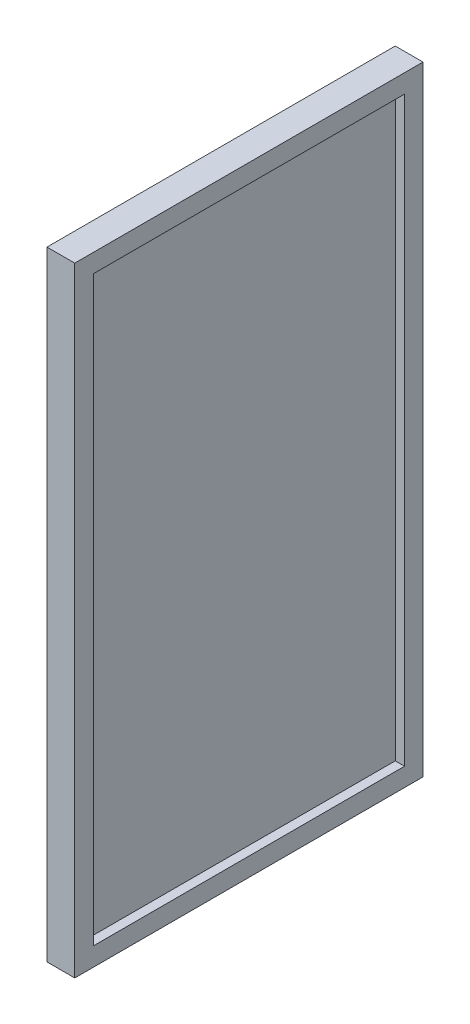
ISO-10303-21;
HEADER;
FILE_DESCRIPTION(('STEP AP214'),'2;1');
FILE_NAME('part.step','',(''),(''),'','','');
FILE_SCHEMA(('AUTOMOTIVE_DESIGN { 1 0 10303 214 1 1 1 1 }'));
ENDSEC;
DATA;
#1=APPLICATION_CONTEXT('core data for automotive mechanical design processes');
#2=APPLICATION_PROTOCOL_DEFINITION('international standard','automotive_design',2000,#1);
#3=PRODUCT_CONTEXT('',#1,'mechanical');
#4=PRODUCT('Part','Part','',(#3));
#5=PRODUCT_RELATED_PRODUCT_CATEGORY('part','',(#4));
#6=PRODUCT_DEFINITION_FORMATION('','',#4);
#7=PRODUCT_DEFINITION_CONTEXT('part definition',#1,'design');
#8=PRODUCT_DEFINITION('design','',#6,#7);
#9=PRODUCT_DEFINITION_SHAPE('','',#8);
#10=(LENGTH_UNIT() NAMED_UNIT(*) SI_UNIT(.MILLI.,.METRE.));
#11=(NAMED_UNIT(*) PLANE_ANGLE_UNIT() SI_UNIT($,.RADIAN.));
#12=(NAMED_UNIT(*) SI_UNIT($,.STERADIAN.) SOLID_ANGLE_UNIT());
#13=UNCERTAINTY_MEASURE_WITH_UNIT(LENGTH_MEASURE(1.E-05),#10,'distance_accuracy_value','');
#14=(GEOMETRIC_REPRESENTATION_CONTEXT(3) GLOBAL_UNCERTAINTY_ASSIGNED_CONTEXT((#13)) GLOBAL_UNIT_ASSIGNED_CONTEXT((#10,
#11,#12)) REPRESENTATION_CONTEXT('',''));
#15=CARTESIAN_POINT('',(0.,0.,0.));
#16=DIRECTION('',(0.,0.,1.));
#17=DIRECTION('',(1.,0.,0.));
#18=AXIS2_PLACEMENT_3D('',#15,#16,#17);
#19=CARTESIAN_POINT('',(59.,-41.,122.906049713048));
#20=DIRECTION('',(0.,0.,-1.));
#21=DIRECTION('',(-1.,0.,0.));
#22=AXIS2_PLACEMENT_3D('',#19,#20,#21);
#23=PLANE('',#22);
#24=DIRECTION('',(0.,-1.,0.));
#25=VECTOR('',#24,1.);
#26=CARTESIAN_POINT('',(56.,-41.,122.906049713048));
#27=LINE('',#26,#25);
#28=CARTESIAN_POINT('',(56.,25.8959813156576,122.906049713048));
#29=VERTEX_POINT('',#28);
#30=CARTESIAN_POINT('',(56.,-41.,122.906049713048));
#31=VERTEX_POINT('',#30);
#32=EDGE_CURVE('E152',#29,#31,#27,.T.);
#33=ORIENTED_EDGE('',*,*,#32,.T.);
#34=DIRECTION('',(-1.,0.,0.));
#35=VECTOR('',#34,1.);
#36=CARTESIAN_POINT('',(59.,-41.,122.906049713048));
#37=LINE('',#36,#35);
#38=CARTESIAN_POINT('',(59.,-41.,122.906049713048));
#39=VERTEX_POINT('',#38);
#40=EDGE_CURVE('E11',#39,#31,#37,.T.);
#41=ORIENTED_EDGE('',*,*,#40,.F.);
#42=DIRECTION('',(0.,-1.,0.));
#43=VECTOR('',#42,1.);
#44=CARTESIAN_POINT('',(59.,-41.,122.906049713048));
#45=LINE('',#44,#43);
#46=CARTESIAN_POINT('',(59.,25.8959813156576,122.906049713048));
#47=VERTEX_POINT('',#46);
#48=EDGE_CURVE('E156',#47,#39,#45,.T.);
#49=ORIENTED_EDGE('',*,*,#48,.F.);
#50=DIRECTION('',(-1.,0.,0.));
#51=VECTOR('',#50,1.);
#52=CARTESIAN_POINT('',(59.,25.8959813156576,122.906049713048));
#53=LINE('',#52,#51);
#54=EDGE_CURVE('E162',#47,#29,#53,.T.);
#55=ORIENTED_EDGE('',*,*,#54,.T.);
#56=EDGE_LOOP('',(#33,#41,#49,#55));
#57=FACE_BOUND('',#56,.T.);
#58=ADVANCED_FACE('F44',(#57),#23,.F.);
#59=CARTESIAN_POINT('',(59.,-41.,122.906049713048));
#60=DIRECTION('',(0.,1.,0.));
#61=DIRECTION('',(-1.,0.,0.));
#62=AXIS2_PLACEMENT_3D('',#59,#60,#61);
#63=PLANE('',#62);
#64=DIRECTION('',(0.,0.,-1.));
#65=VECTOR('',#64,1.);
#66=CARTESIAN_POINT('',(56.,-41.,122.906049713048));
#67=LINE('',#66,#65);
#68=CARTESIAN_POINT('',(56.,-41.,85.2747997130479));
#69=VERTEX_POINT('',#68);
#70=EDGE_CURVE('E165',#31,#69,#67,.T.);
#71=ORIENTED_EDGE('',*,*,#70,.T.);
#72=DIRECTION('',(-1.,0.,0.));
#73=VECTOR('',#72,1.);
#74=CARTESIAN_POINT('',(59.,-41.,85.2747997130479));
#75=LINE('',#74,#73);
#76=CARTESIAN_POINT('',(59.,-41.,85.2747997130479));
#77=VERTEX_POINT('',#76);
#78=EDGE_CURVE('E51',#77,#69,#75,.T.);
#79=ORIENTED_EDGE('',*,*,#78,.F.);
#80=DIRECTION('',(0.,0.,-1.));
#81=VECTOR('',#80,1.);
#82=CARTESIAN_POINT('',(59.,-41.,122.906049713048));
#83=LINE('',#82,#81);
#84=EDGE_CURVE('E95',#39,#77,#83,.T.);
#85=ORIENTED_EDGE('',*,*,#84,.F.);
#86=ORIENTED_EDGE('',*,*,#40,.T.);
#87=EDGE_LOOP('',(#71,#79,#85,#86));
#88=FACE_BOUND('',#87,.T.);
#89=ADVANCED_FACE('F194',(#88),#63,.F.);
#90=CARTESIAN_POINT('',(59.,-41.,85.2747997130479));
#91=DIRECTION('',(0.,0.,1.));
#92=DIRECTION('',(1.,0.,0.));
#93=AXIS2_PLACEMENT_3D('',#90,#91,#92);
#94=PLANE('',#93);
#95=DIRECTION('',(0.,1.,0.));
#96=VECTOR('',#95,1.);
#97=CARTESIAN_POINT('',(56.,-41.,85.2747997130479));
#98=LINE('',#97,#96);
#99=CARTESIAN_POINT('',(56.,25.8959813156576,85.2747997130479));
#100=VERTEX_POINT('',#99);
#101=EDGE_CURVE('E167',#69,#100,#98,.T.);
#102=ORIENTED_EDGE('',*,*,#101,.T.);
#103=DIRECTION('',(-1.,0.,0.));
#104=VECTOR('',#103,1.);
#105=CARTESIAN_POINT('',(59.,25.8959813156576,85.2747997130479));
#106=LINE('',#105,#104);
#107=CARTESIAN_POINT('',(59.,25.8959813156576,85.2747997130479));
#108=VERTEX_POINT('',#107);
#109=EDGE_CURVE('E171',#108,#100,#106,.T.);
#110=ORIENTED_EDGE('',*,*,#109,.F.);
#111=DIRECTION('',(0.,1.,0.));
#112=VECTOR('',#111,1.);
#113=CARTESIAN_POINT('',(59.,-41.,85.2747997130479));
#114=LINE('',#113,#112);
#115=EDGE_CURVE('E159',#77,#108,#114,.T.);
#116=ORIENTED_EDGE('',*,*,#115,.F.);
#117=ORIENTED_EDGE('',*,*,#78,.T.);
#118=EDGE_LOOP('',(#102,#110,#116,#117));
#119=FACE_BOUND('',#118,.T.);
#120=ADVANCED_FACE('F176',(#119),#94,.F.);
#121=CARTESIAN_POINT('',(59.,25.8959813156576,122.906049713048));
#122=DIRECTION('',(0.,-1.,0.));
#123=DIRECTION('',(1.,0.,0.));
#124=AXIS2_PLACEMENT_3D('',#121,#122,#123);
#125=PLANE('',#124);
#126=DIRECTION('',(0.,0.,1.));
#127=VECTOR('',#126,1.);
#128=CARTESIAN_POINT('',(56.,25.8959813156576,122.906049713048));
#129=LINE('',#128,#127);
#130=EDGE_CURVE('E88',#100,#29,#129,.T.);
#131=ORIENTED_EDGE('',*,*,#130,.T.);
#132=ORIENTED_EDGE('',*,*,#54,.F.);
#133=DIRECTION('',(0.,0.,1.));
#134=VECTOR('',#133,1.);
#135=CARTESIAN_POINT('',(59.,25.8959813156576,122.906049713048));
#136=LINE('',#135,#134);
#137=EDGE_CURVE('E67',#108,#47,#136,.T.);
#138=ORIENTED_EDGE('',*,*,#137,.F.);
#139=ORIENTED_EDGE('',*,*,#109,.T.);
#140=EDGE_LOOP('',(#131,#132,#138,#139));
#141=FACE_BOUND('',#140,.T.);
#142=ADVANCED_FACE('F184',(#141),#125,.F.);
#143=CARTESIAN_POINT('',(59.,0.,0.));
#144=DIRECTION('',(-1.,0.,0.));
#145=DIRECTION('',(0.,-1.,0.));
#146=AXIS2_PLACEMENT_3D('',#143,#144,#145);
#147=PLANE('',#146);
#148=DIRECTION('',(0.,0.,1.));
#149=VECTOR('',#148,1.);
#150=CARTESIAN_POINT('',(59.,23.8959813156576,0.));
#151=LINE('',#150,#149);
#152=CARTESIAN_POINT('',(59.,23.8959813156576,87.2747997130479));
#153=VERTEX_POINT('',#152);
#154=CARTESIAN_POINT('',(59.,23.8959813156576,120.906049713048));
#155=VERTEX_POINT('',#154);
#156=EDGE_CURVE('E146',#153,#155,#151,.T.);
#157=ORIENTED_EDGE('',*,*,#156,.F.);
#158=DIRECTION('',(0.,1.,0.));
#159=VECTOR('',#158,1.);
#160=CARTESIAN_POINT('',(59.,0.,87.2747997130479));
#161=LINE('',#160,#159);
#162=CARTESIAN_POINT('',(59.,-39.,87.2747997130479));
#163=VERTEX_POINT('',#162);
#164=EDGE_CURVE('E58',#163,#153,#161,.T.);
#165=ORIENTED_EDGE('',*,*,#164,.F.);
#166=DIRECTION('',(0.,0.,-1.));
#167=VECTOR('',#166,1.);
#168=CARTESIAN_POINT('',(59.,-39.,0.));
#169=LINE('',#168,#167);
#170=CARTESIAN_POINT('',(59.,-39.,120.906049713048));
#171=VERTEX_POINT('',#170);
#172=EDGE_CURVE('E137',#171,#163,#169,.T.);
#173=ORIENTED_EDGE('',*,*,#172,.F.);
#174=DIRECTION('',(0.,-1.,0.));
#175=VECTOR('',#174,1.);
#176=CARTESIAN_POINT('',(59.,0.,120.906049713048));
#177=LINE('',#176,#175);
#178=EDGE_CURVE('E140',#155,#171,#177,.T.);
#179=ORIENTED_EDGE('',*,*,#178,.F.);
#180=EDGE_LOOP('',(#157,#165,#173,#179));
#181=FACE_BOUND('',#180,.T.);
#182=ORIENTED_EDGE('',*,*,#48,.T.);
#183=ORIENTED_EDGE('',*,*,#84,.T.);
#184=ORIENTED_EDGE('',*,*,#115,.T.);
#185=ORIENTED_EDGE('',*,*,#137,.T.);
#186=EDGE_LOOP('',(#182,#183,#184,#185));
#187=FACE_BOUND('',#186,.T.);
#188=ADVANCED_FACE('F186',(#181,#187),#147,.F.);
#189=CARTESIAN_POINT('',(56.,0.,0.));
#190=DIRECTION('',(-1.,0.,0.));
#191=DIRECTION('',(0.,-1.,0.));
#192=AXIS2_PLACEMENT_3D('',#189,#190,#191);
#193=PLANE('',#192);
#194=ORIENTED_EDGE('',*,*,#32,.F.);
#195=ORIENTED_EDGE('',*,*,#130,.F.);
#196=ORIENTED_EDGE('',*,*,#101,.F.);
#197=ORIENTED_EDGE('',*,*,#70,.F.);
#198=EDGE_LOOP('',(#194,#195,#196,#197));
#199=FACE_BOUND('',#198,.T.);
#200=ADVANCED_FACE('F180',(#199),#193,.T.);
#201=CARTESIAN_POINT('',(58.,0.,87.2747997130479));
#202=DIRECTION('',(0.,0.,-1.));
#203=DIRECTION('',(-1.,0.,0.));
#204=AXIS2_PLACEMENT_3D('',#201,#202,#203);
#205=PLANE('',#204);
#206=ORIENTED_EDGE('',*,*,#164,.T.);
#207=DIRECTION('',(1.,0.,0.));
#208=VECTOR('',#207,1.);
#209=CARTESIAN_POINT('',(58.,23.8959813156576,87.2747997130479));
#210=LINE('',#209,#208);
#211=CARTESIAN_POINT('',(58.,23.8959813156576,87.2747997130479));
#212=VERTEX_POINT('',#211);
#213=EDGE_CURVE('E115',#212,#153,#210,.T.);
#214=ORIENTED_EDGE('',*,*,#213,.F.);
#215=DIRECTION('',(0.,1.,0.));
#216=VECTOR('',#215,1.);
#217=CARTESIAN_POINT('',(58.,0.,87.2747997130479));
#218=LINE('',#217,#216);
#219=CARTESIAN_POINT('',(58.,-39.,87.2747997130479));
#220=VERTEX_POINT('',#219);
#221=EDGE_CURVE('E119',#220,#212,#218,.T.);
#222=ORIENTED_EDGE('',*,*,#221,.F.);
#223=DIRECTION('',(1.,0.,0.));
#224=VECTOR('',#223,1.);
#225=CARTESIAN_POINT('',(58.,-39.,87.2747997130479));
#226=LINE('',#225,#224);
#227=EDGE_CURVE('E150',#220,#163,#226,.T.);
#228=ORIENTED_EDGE('',*,*,#227,.T.);
#229=EDGE_LOOP('',(#206,#214,#222,#228));
#230=FACE_BOUND('',#229,.T.);
#231=ADVANCED_FACE('F117',(#230),#205,.F.);
#232=CARTESIAN_POINT('',(58.,-39.,0.));
#233=DIRECTION('',(0.,-1.,0.));
#234=DIRECTION('',(1.,0.,0.));
#235=AXIS2_PLACEMENT_3D('',#232,#233,#234);
#236=PLANE('',#235);
#237=ORIENTED_EDGE('',*,*,#172,.T.);
#238=ORIENTED_EDGE('',*,*,#227,.F.);
#239=DIRECTION('',(0.,0.,-1.));
#240=VECTOR('',#239,1.);
#241=CARTESIAN_POINT('',(58.,-39.,0.));
#242=LINE('',#241,#240);
#243=CARTESIAN_POINT('',(58.,-39.,120.906049713048));
#244=VERTEX_POINT('',#243);
#245=EDGE_CURVE('E125',#244,#220,#242,.T.);
#246=ORIENTED_EDGE('',*,*,#245,.F.);
#247=DIRECTION('',(1.,0.,0.));
#248=VECTOR('',#247,1.);
#249=CARTESIAN_POINT('',(58.,-39.,120.906049713048));
#250=LINE('',#249,#248);
#251=EDGE_CURVE('E153',#244,#171,#250,.T.);
#252=ORIENTED_EDGE('',*,*,#251,.T.);
#253=EDGE_LOOP('',(#237,#238,#246,#252));
#254=FACE_BOUND('',#253,.T.);
#255=ADVANCED_FACE('F240',(#254),#236,.F.);
#256=CARTESIAN_POINT('',(58.,0.,120.906049713048));
#257=DIRECTION('',(0.,0.,1.));
#258=DIRECTION('',(1.,0.,0.));
#259=AXIS2_PLACEMENT_3D('',#256,#257,#258);
#260=PLANE('',#259);
#261=ORIENTED_EDGE('',*,*,#178,.T.);
#262=ORIENTED_EDGE('',*,*,#251,.F.);
#263=DIRECTION('',(0.,-1.,0.));
#264=VECTOR('',#263,1.);
#265=CARTESIAN_POINT('',(58.,0.,120.906049713048));
#266=LINE('',#265,#264);
#267=CARTESIAN_POINT('',(58.,23.8959813156576,120.906049713048));
#268=VERTEX_POINT('',#267);
#269=EDGE_CURVE('E133',#268,#244,#266,.T.);
#270=ORIENTED_EDGE('',*,*,#269,.F.);
#271=DIRECTION('',(1.,0.,0.));
#272=VECTOR('',#271,1.);
#273=CARTESIAN_POINT('',(58.,23.8959813156576,120.906049713048));
#274=LINE('',#273,#272);
#275=EDGE_CURVE('E124',#268,#155,#274,.T.);
#276=ORIENTED_EDGE('',*,*,#275,.T.);
#277=EDGE_LOOP('',(#261,#262,#270,#276));
#278=FACE_BOUND('',#277,.T.);
#279=ADVANCED_FACE('F250',(#278),#260,.F.);
#280=CARTESIAN_POINT('',(58.,23.8959813156576,0.));
#281=DIRECTION('',(0.,1.,0.));
#282=DIRECTION('',(-1.,0.,0.));
#283=AXIS2_PLACEMENT_3D('',#280,#281,#282);
#284=PLANE('',#283);
#285=ORIENTED_EDGE('',*,*,#156,.T.);
#286=ORIENTED_EDGE('',*,*,#275,.F.);
#287=DIRECTION('',(0.,0.,1.));
#288=VECTOR('',#287,1.);
#289=CARTESIAN_POINT('',(58.,23.8959813156576,0.));
#290=LINE('',#289,#288);
#291=EDGE_CURVE('E128',#212,#268,#290,.T.);
#292=ORIENTED_EDGE('',*,*,#291,.F.);
#293=ORIENTED_EDGE('',*,*,#213,.T.);
#294=EDGE_LOOP('',(#285,#286,#292,#293));
#295=FACE_BOUND('',#294,.T.);
#296=ADVANCED_FACE('F129',(#295),#284,.F.);
#297=CARTESIAN_POINT('',(58.,0.,0.));
#298=DIRECTION('',(1.,0.,0.));
#299=DIRECTION('',(0.,1.,0.));
#300=AXIS2_PLACEMENT_3D('',#297,#298,#299);
#301=PLANE('',#300);
#302=ORIENTED_EDGE('',*,*,#221,.T.);
#303=ORIENTED_EDGE('',*,*,#291,.T.);
#304=ORIENTED_EDGE('',*,*,#269,.T.);
#305=ORIENTED_EDGE('',*,*,#245,.T.);
#306=EDGE_LOOP('',(#302,#303,#304,#305));
#307=FACE_BOUND('',#306,.T.);
#308=ADVANCED_FACE('F135',(#307),#301,.T.);
#309=CLOSED_SHELL('',(#58,#89,#120,#142,#188,#200,#231,#255,#279,#296,#308));
#310=MANIFOLD_SOLID_BREP('B2',#309);
#311=ADVANCED_BREP_SHAPE_REPRESENTATION('',(#18,#310),#14);
#312=SHAPE_DEFINITION_REPRESENTATION(#9,#311);
ENDSEC;
END-ISO-10303-21;
